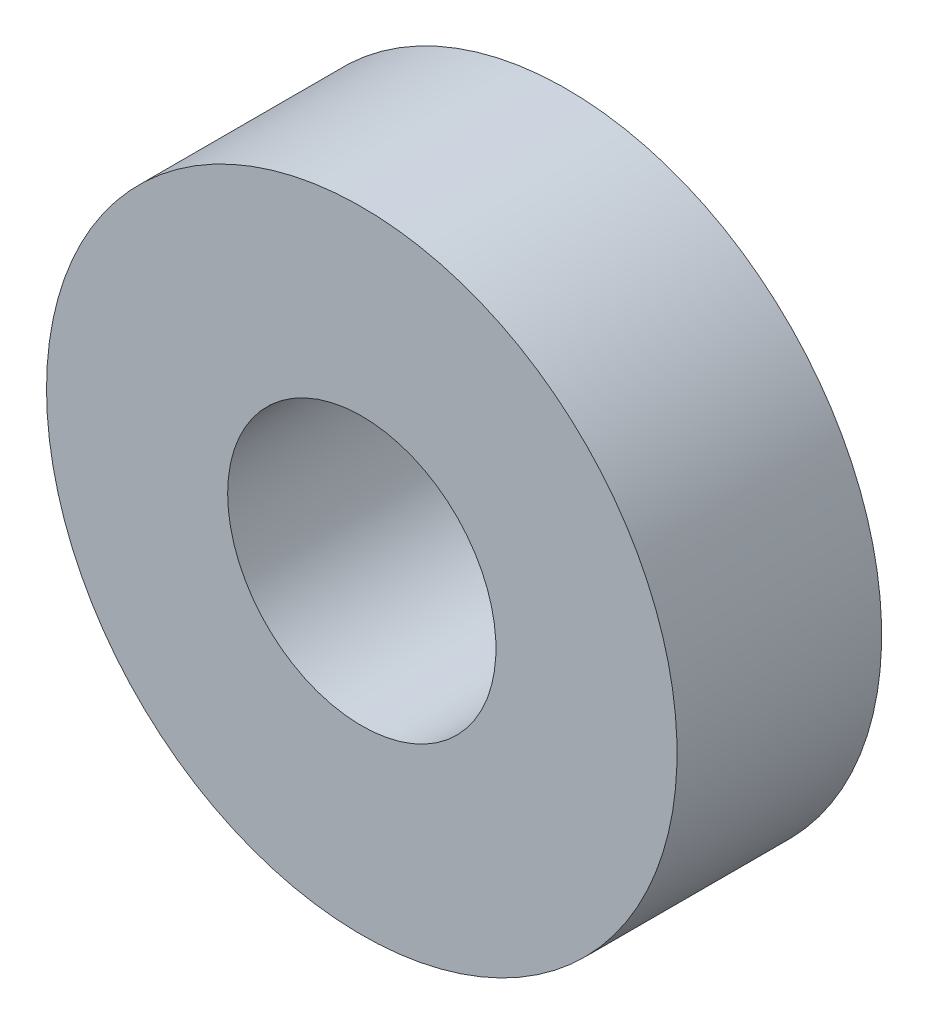
ISO-10303-21;
HEADER;
FILE_DESCRIPTION(('STEP AP214'),'2;1');
FILE_NAME('part.step','',(''),(''),'','','');
FILE_SCHEMA(('AUTOMOTIVE_DESIGN { 1 0 10303 214 1 1 1 1 }'));
ENDSEC;
DATA;
#1=APPLICATION_CONTEXT('core data for automotive mechanical design processes');
#2=APPLICATION_PROTOCOL_DEFINITION('international standard','automotive_design',2000,#1);
#3=PRODUCT_CONTEXT('',#1,'mechanical');
#4=PRODUCT('Part','Part','',(#3));
#5=PRODUCT_RELATED_PRODUCT_CATEGORY('part','',(#4));
#6=PRODUCT_DEFINITION_FORMATION('','',#4);
#7=PRODUCT_DEFINITION_CONTEXT('part definition',#1,'design');
#8=PRODUCT_DEFINITION('design','',#6,#7);
#9=PRODUCT_DEFINITION_SHAPE('','',#8);
#10=(LENGTH_UNIT() NAMED_UNIT(*) SI_UNIT(.MILLI.,.METRE.));
#11=(NAMED_UNIT(*) PLANE_ANGLE_UNIT() SI_UNIT($,.RADIAN.));
#12=(NAMED_UNIT(*) SI_UNIT($,.STERADIAN.) SOLID_ANGLE_UNIT());
#13=UNCERTAINTY_MEASURE_WITH_UNIT(LENGTH_MEASURE(1.E-05),#10,'distance_accuracy_value','');
#14=(GEOMETRIC_REPRESENTATION_CONTEXT(3) GLOBAL_UNCERTAINTY_ASSIGNED_CONTEXT((#13)) GLOBAL_UNIT_ASSIGNED_CONTEXT((#10,
#11,#12)) REPRESENTATION_CONTEXT('',''));
#15=CARTESIAN_POINT('',(0.,0.,0.));
#16=DIRECTION('',(0.,0.,1.));
#17=DIRECTION('',(1.,0.,0.));
#18=AXIS2_PLACEMENT_3D('',#15,#16,#17);
#19=CARTESIAN_POINT('',(0.,0.,15.25));
#20=DIRECTION('',(0.,0.,1.));
#21=DIRECTION('',(1.,0.,0.));
#22=AXIS2_PLACEMENT_3D('',#19,#20,#21);
#23=PLANE('',#22);
#24=CARTESIAN_POINT('',(0.,0.,15.25));
#25=DIRECTION('',(0.,0.,1.));
#26=DIRECTION('',(1.,0.,0.));
#27=AXIS2_PLACEMENT_3D('',#24,#25,#26);
#28=CIRCLE('',#27,23.5);
#29=CARTESIAN_POINT('',(-23.5,0.,15.25));
#30=VERTEX_POINT('',#29);
#31=EDGE_CURVE('E10',#30,#30,#28,.T.);
#32=ORIENTED_EDGE('',*,*,#31,.T.);
#33=EDGE_LOOP('',(#32));
#34=FACE_BOUND('',#33,.T.);
#35=CARTESIAN_POINT('',(0.,0.,15.25));
#36=DIRECTION('',(0.,0.,1.));
#37=DIRECTION('',(1.,0.,0.));
#38=AXIS2_PLACEMENT_3D('',#35,#36,#37);
#39=CIRCLE('',#38,10.);
#40=CARTESIAN_POINT('',(-10.,0.,15.25));
#41=VERTEX_POINT('',#40);
#42=EDGE_CURVE('E46',#41,#41,#39,.T.);
#43=ORIENTED_EDGE('',*,*,#42,.F.);
#44=EDGE_LOOP('',(#43));
#45=FACE_BOUND('',#44,.T.);
#46=ADVANCED_FACE('F35',(#34,#45),#23,.T.);
#47=CARTESIAN_POINT('',(0.,0.,0.));
#48=DIRECTION('',(0.,0.,1.));
#49=DIRECTION('',(1.,0.,0.));
#50=AXIS2_PLACEMENT_3D('',#47,#48,#49);
#51=PLANE('',#50);
#52=CARTESIAN_POINT('',(0.,0.,0.));
#53=DIRECTION('',(0.,0.,1.));
#54=DIRECTION('',(1.,0.,0.));
#55=AXIS2_PLACEMENT_3D('',#52,#53,#54);
#56=CIRCLE('',#55,23.5);
#57=CARTESIAN_POINT('',(-23.5,0.,0.));
#58=VERTEX_POINT('',#57);
#59=EDGE_CURVE('E39',#58,#58,#56,.T.);
#60=ORIENTED_EDGE('',*,*,#59,.F.);
#61=EDGE_LOOP('',(#60));
#62=FACE_BOUND('',#61,.T.);
#63=CARTESIAN_POINT('',(0.,0.,0.));
#64=DIRECTION('',(0.,0.,1.));
#65=DIRECTION('',(1.,0.,0.));
#66=AXIS2_PLACEMENT_3D('',#63,#64,#65);
#67=CIRCLE('',#66,10.);
#68=CARTESIAN_POINT('',(-10.,0.,0.));
#69=VERTEX_POINT('',#68);
#70=EDGE_CURVE('E48',#69,#69,#67,.T.);
#71=ORIENTED_EDGE('',*,*,#70,.T.);
#72=EDGE_LOOP('',(#71));
#73=FACE_BOUND('',#72,.T.);
#74=ADVANCED_FACE('F58',(#62,#73),#51,.F.);
#75=CARTESIAN_POINT('',(0.,0.,15.25));
#76=DIRECTION('',(0.,0.,-1.));
#77=DIRECTION('',(-1.,0.,0.));
#78=AXIS2_PLACEMENT_3D('',#75,#76,#77);
#79=CYLINDRICAL_SURFACE('',#78,23.5);
#80=CARTESIAN_POINT('',(-23.5,0.,15.25));
#81=CARTESIAN_POINT('',(-23.5,0.,15.0911458333333));
#82=CARTESIAN_POINT('',(-23.5,0.,14.9322916666667));
#83=CARTESIAN_POINT('',(-23.5,0.,14.6145833333333));
#84=CARTESIAN_POINT('',(-23.5,0.,14.4557291666667));
#85=CARTESIAN_POINT('',(-23.5,0.,14.1380208333333));
#86=CARTESIAN_POINT('',(-23.5,0.,13.9791666666667));
#87=CARTESIAN_POINT('',(-23.5,0.,13.6614583333333));
#88=CARTESIAN_POINT('',(-23.5,0.,13.5026041666667));
#89=CARTESIAN_POINT('',(-23.5,0.,13.1848958333333));
#90=CARTESIAN_POINT('',(-23.5,0.,13.0260416666667));
#91=CARTESIAN_POINT('',(-23.5,0.,12.7083333333333));
#92=CARTESIAN_POINT('',(-23.5,0.,12.5494791666667));
#93=CARTESIAN_POINT('',(-23.5,0.,12.2317708333333));
#94=CARTESIAN_POINT('',(-23.5,0.,12.0729166666667));
#95=CARTESIAN_POINT('',(-23.5,0.,11.7552083333333));
#96=CARTESIAN_POINT('',(-23.5,0.,11.5963541666667));
#97=CARTESIAN_POINT('',(-23.5,0.,11.2786458333333));
#98=CARTESIAN_POINT('',(-23.5,0.,11.1197916666667));
#99=CARTESIAN_POINT('',(-23.5,0.,10.8020833333333));
#100=CARTESIAN_POINT('',(-23.5,0.,10.6432291666667));
#101=CARTESIAN_POINT('',(-23.5,0.,10.3255208333333));
#102=CARTESIAN_POINT('',(-23.5,0.,10.1666666666667));
#103=CARTESIAN_POINT('',(-23.5,0.,9.84895833333333));
#104=CARTESIAN_POINT('',(-23.5,0.,9.69010416666666));
#105=CARTESIAN_POINT('',(-23.5,0.,9.37239583333333));
#106=CARTESIAN_POINT('',(-23.5,0.,9.21354166666666));
#107=CARTESIAN_POINT('',(-23.5,0.,8.89583333333333));
#108=CARTESIAN_POINT('',(-23.5,0.,8.73697916666667));
#109=CARTESIAN_POINT('',(-23.5,0.,8.41927083333333));
#110=CARTESIAN_POINT('',(-23.5,0.,8.26041666666667));
#111=CARTESIAN_POINT('',(-23.5,0.,7.94270833333333));
#112=CARTESIAN_POINT('',(-23.5,0.,7.78385416666667));
#113=CARTESIAN_POINT('',(-23.5,0.,7.46614583333333));
#114=CARTESIAN_POINT('',(-23.5,0.,7.30729166666667));
#115=CARTESIAN_POINT('',(-23.5,0.,6.98958333333333));
#116=CARTESIAN_POINT('',(-23.5,0.,6.83072916666667));
#117=CARTESIAN_POINT('',(-23.5,0.,6.51302083333333));
#118=CARTESIAN_POINT('',(-23.5,0.,6.35416666666667));
#119=CARTESIAN_POINT('',(-23.5,0.,6.03645833333333));
#120=CARTESIAN_POINT('',(-23.5,0.,5.87760416666667));
#121=CARTESIAN_POINT('',(-23.5,0.,5.55989583333333));
#122=CARTESIAN_POINT('',(-23.5,0.,5.40104166666667));
#123=CARTESIAN_POINT('',(-23.5,0.,5.08333333333333));
#124=CARTESIAN_POINT('',(-23.5,0.,4.92447916666667));
#125=CARTESIAN_POINT('',(-23.5,0.,4.60677083333333));
#126=CARTESIAN_POINT('',(-23.5,0.,4.44791666666667));
#127=CARTESIAN_POINT('',(-23.5,0.,4.13020833333333));
#128=CARTESIAN_POINT('',(-23.5,0.,3.97135416666667));
#129=CARTESIAN_POINT('',(-23.5,0.,3.65364583333333));
#130=CARTESIAN_POINT('',(-23.5,0.,3.49479166666667));
#131=CARTESIAN_POINT('',(-23.5,0.,3.17708333333333));
#132=CARTESIAN_POINT('',(-23.5,0.,3.01822916666667));
#133=CARTESIAN_POINT('',(-23.5,0.,2.70052083333333));
#134=CARTESIAN_POINT('',(-23.5,0.,2.54166666666666));
#135=CARTESIAN_POINT('',(-23.5,0.,2.22395833333333));
#136=CARTESIAN_POINT('',(-23.5,0.,2.06510416666666));
#137=CARTESIAN_POINT('',(-23.5,0.,1.74739583333333));
#138=CARTESIAN_POINT('',(-23.5,0.,1.58854166666667));
#139=CARTESIAN_POINT('',(-23.5,0.,1.27083333333333));
#140=CARTESIAN_POINT('',(-23.5,0.,1.11197916666667));
#141=CARTESIAN_POINT('',(-23.5,0.,0.794270833333332));
#142=CARTESIAN_POINT('',(-23.5,0.,0.635416666666665));
#143=CARTESIAN_POINT('',(-23.5,0.,0.317708333333331));
#144=CARTESIAN_POINT('',(-23.5,0.,0.158854166666665));
#145=CARTESIAN_POINT('',(-23.5,0.,0.));
#146=B_SPLINE_CURVE_WITH_KNOTS('',3,(#80,#81,#82,#83,#84,#85,#86,#87,#88,#89,#90,#91,#92,#93,
#94,#95,#96,#97,#98,#99,#100,#101,#102,#103,#104,#105,#106,#107,#108,#109,#110,#111,#112,#113,
#114,#115,#116,#117,#118,#119,#120,#121,#122,#123,#124,#125,#126,#127,#128,#129,#130,#131,#132,
#133,#134,#135,#136,#137,#138,#139,#140,#141,#142,#143,#144,#145),.UNSPECIFIED.,.F.,.F.,(4,2,2,
2,2,2,2,2,2,2,2,2,2,2,2,2,2,2,2,2,2,2,2,2,2,2,2,2,2,2,2,2,4),(0.,0.4765625,0.953124999999999,
1.4296875,1.90625,2.3828125,2.859375,3.3359375,3.8125,4.2890625,4.765625,5.2421875,5.71875,
6.1953125,6.671875,7.1484375,7.625,8.1015625,8.578125,9.0546875,9.53125,10.0078125,10.484375,
10.9609375,11.4375,11.9140625,12.390625,12.8671875,13.34375,13.8203125,14.296875,14.7734375,
15.25),.UNSPECIFIED.);
#147=EDGE_CURVE('BSEAM37',#30,#58,#146,.T.);
#148=ORIENTED_EDGE('',*,*,#31,.F.);
#149=ORIENTED_EDGE('',*,*,#59,.T.);
#150=ORIENTED_EDGE('',*,*,#147,.T.);
#151=ORIENTED_EDGE('',*,*,#147,.F.);
#152=EDGE_LOOP('',(#148,#150,#149,#151));
#153=FACE_BOUND('',#152,.T.);
#154=ADVANCED_FACE('F37',(#153),#79,.T.);
#155=CARTESIAN_POINT('',(0.,0.,15.25));
#156=DIRECTION('',(0.,0.,-1.));
#157=DIRECTION('',(-1.,0.,0.));
#158=AXIS2_PLACEMENT_3D('',#155,#156,#157);
#159=CYLINDRICAL_SURFACE('',#158,10.);
#160=CARTESIAN_POINT('',(-10.,0.,15.25));
#161=CARTESIAN_POINT('',(-10.,0.,15.0911458333333));
#162=CARTESIAN_POINT('',(-10.,0.,14.9322916666667));
#163=CARTESIAN_POINT('',(-10.,0.,14.6145833333333));
#164=CARTESIAN_POINT('',(-10.,0.,14.4557291666667));
#165=CARTESIAN_POINT('',(-10.,0.,14.1380208333333));
#166=CARTESIAN_POINT('',(-10.,0.,13.9791666666667));
#167=CARTESIAN_POINT('',(-10.,0.,13.6614583333333));
#168=CARTESIAN_POINT('',(-10.,0.,13.5026041666667));
#169=CARTESIAN_POINT('',(-10.,0.,13.1848958333333));
#170=CARTESIAN_POINT('',(-10.,0.,13.0260416666667));
#171=CARTESIAN_POINT('',(-10.,0.,12.7083333333333));
#172=CARTESIAN_POINT('',(-10.,0.,12.5494791666667));
#173=CARTESIAN_POINT('',(-10.,0.,12.2317708333333));
#174=CARTESIAN_POINT('',(-10.,0.,12.0729166666667));
#175=CARTESIAN_POINT('',(-10.,0.,11.7552083333333));
#176=CARTESIAN_POINT('',(-10.,0.,11.5963541666667));
#177=CARTESIAN_POINT('',(-10.,0.,11.2786458333333));
#178=CARTESIAN_POINT('',(-10.,0.,11.1197916666667));
#179=CARTESIAN_POINT('',(-10.,0.,10.8020833333333));
#180=CARTESIAN_POINT('',(-10.,0.,10.6432291666667));
#181=CARTESIAN_POINT('',(-10.,0.,10.3255208333333));
#182=CARTESIAN_POINT('',(-10.,0.,10.1666666666667));
#183=CARTESIAN_POINT('',(-10.,0.,9.84895833333333));
#184=CARTESIAN_POINT('',(-10.,0.,9.69010416666666));
#185=CARTESIAN_POINT('',(-10.,0.,9.37239583333333));
#186=CARTESIAN_POINT('',(-10.,0.,9.21354166666666));
#187=CARTESIAN_POINT('',(-10.,0.,8.89583333333333));
#188=CARTESIAN_POINT('',(-10.,0.,8.73697916666667));
#189=CARTESIAN_POINT('',(-10.,0.,8.41927083333333));
#190=CARTESIAN_POINT('',(-10.,0.,8.26041666666667));
#191=CARTESIAN_POINT('',(-10.,0.,7.94270833333333));
#192=CARTESIAN_POINT('',(-10.,0.,7.78385416666667));
#193=CARTESIAN_POINT('',(-10.,0.,7.46614583333333));
#194=CARTESIAN_POINT('',(-10.,0.,7.30729166666667));
#195=CARTESIAN_POINT('',(-10.,0.,6.98958333333333));
#196=CARTESIAN_POINT('',(-10.,0.,6.83072916666667));
#197=CARTESIAN_POINT('',(-10.,0.,6.51302083333333));
#198=CARTESIAN_POINT('',(-10.,0.,6.35416666666667));
#199=CARTESIAN_POINT('',(-10.,0.,6.03645833333333));
#200=CARTESIAN_POINT('',(-10.,0.,5.87760416666667));
#201=CARTESIAN_POINT('',(-10.,0.,5.55989583333333));
#202=CARTESIAN_POINT('',(-10.,0.,5.40104166666667));
#203=CARTESIAN_POINT('',(-10.,0.,5.08333333333333));
#204=CARTESIAN_POINT('',(-10.,0.,4.92447916666667));
#205=CARTESIAN_POINT('',(-10.,0.,4.60677083333333));
#206=CARTESIAN_POINT('',(-10.,0.,4.44791666666667));
#207=CARTESIAN_POINT('',(-10.,0.,4.13020833333333));
#208=CARTESIAN_POINT('',(-10.,0.,3.97135416666667));
#209=CARTESIAN_POINT('',(-10.,0.,3.65364583333333));
#210=CARTESIAN_POINT('',(-10.,0.,3.49479166666667));
#211=CARTESIAN_POINT('',(-10.,0.,3.17708333333333));
#212=CARTESIAN_POINT('',(-10.,0.,3.01822916666667));
#213=CARTESIAN_POINT('',(-10.,0.,2.70052083333333));
#214=CARTESIAN_POINT('',(-10.,0.,2.54166666666667));
#215=CARTESIAN_POINT('',(-10.,0.,2.22395833333333));
#216=CARTESIAN_POINT('',(-10.,0.,2.06510416666667));
#217=CARTESIAN_POINT('',(-10.,0.,1.74739583333333));
#218=CARTESIAN_POINT('',(-10.,0.,1.58854166666667));
#219=CARTESIAN_POINT('',(-10.,0.,1.27083333333333));
#220=CARTESIAN_POINT('',(-10.,0.,1.11197916666667));
#221=CARTESIAN_POINT('',(-10.,0.,0.794270833333332));
#222=CARTESIAN_POINT('',(-10.,0.,0.635416666666665));
#223=CARTESIAN_POINT('',(-10.,0.,0.317708333333331));
#224=CARTESIAN_POINT('',(-10.,0.,0.158854166666665));
#225=CARTESIAN_POINT('',(-10.,0.,0.));
#226=B_SPLINE_CURVE_WITH_KNOTS('',3,(#160,#161,#162,#163,#164,#165,#166,#167,#168,#169,#170,
#171,#172,#173,#174,#175,#176,#177,#178,#179,#180,#181,#182,#183,#184,#185,#186,#187,#188,#189,
#190,#191,#192,#193,#194,#195,#196,#197,#198,#199,#200,#201,#202,#203,#204,#205,#206,#207,#208,
#209,#210,#211,#212,#213,#214,#215,#216,#217,#218,#219,#220,#221,#222,#223,#224,#225),
.UNSPECIFIED.,.F.,.F.,(4,2,2,2,2,2,2,2,2,2,2,2,2,2,2,2,2,2,2,2,2,2,2,2,2,2,2,2,2,2,2,2,4),(0.,
0.476562500000001,0.953125000000001,1.4296875,1.90625,2.3828125,2.859375,3.3359375,3.8125,
4.2890625,4.765625,5.2421875,5.71875,6.1953125,6.671875,7.1484375,7.625,8.1015625,8.578125,
9.0546875,9.53125,10.0078125,10.484375,10.9609375,11.4375,11.9140625,12.390625,12.8671875,
13.34375,13.8203125,14.296875,14.7734375,15.25),.UNSPECIFIED.);
#227=EDGE_CURVE('BSEAM54',#41,#69,#226,.T.);
#228=ORIENTED_EDGE('',*,*,#42,.T.);
#229=ORIENTED_EDGE('',*,*,#70,.F.);
#230=ORIENTED_EDGE('',*,*,#227,.T.);
#231=ORIENTED_EDGE('',*,*,#227,.F.);
#232=EDGE_LOOP('',(#228,#230,#229,#231));
#233=FACE_BOUND('',#232,.T.);
#234=ADVANCED_FACE('F54',(#233),#159,.F.);
#235=CLOSED_SHELL('',(#46,#74,#154,#234));
#236=MANIFOLD_SOLID_BREP('B2',#235);
#237=ADVANCED_BREP_SHAPE_REPRESENTATION('',(#18,#236),#14);
#238=SHAPE_DEFINITION_REPRESENTATION(#9,#237);
ENDSEC;
END-ISO-10303-21;
